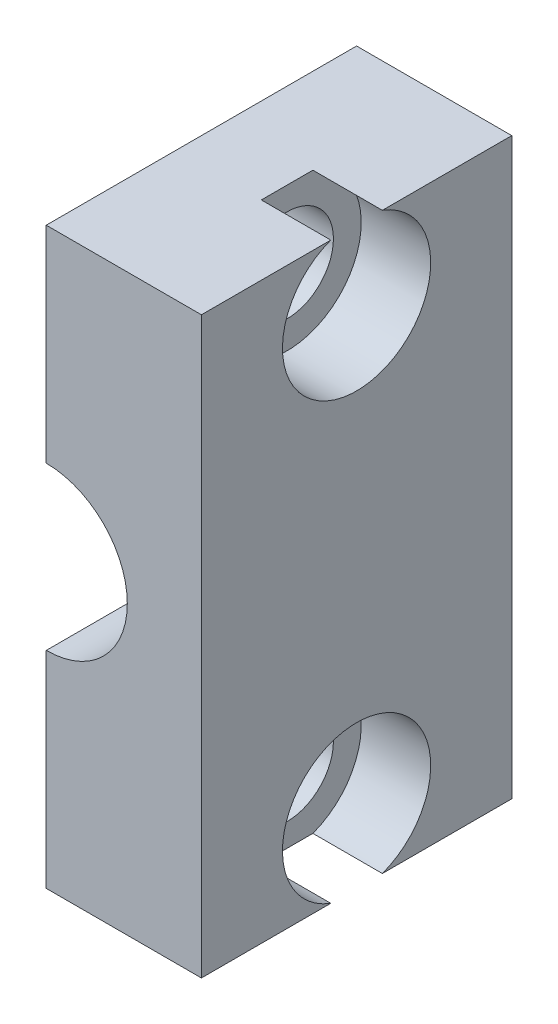
ISO-10303-21;
HEADER;
FILE_DESCRIPTION(('STEP AP214'),'2;1');
FILE_NAME('part.step','',(''),(''),'','','');
FILE_SCHEMA(('AUTOMOTIVE_DESIGN { 1 0 10303 214 1 1 1 1 }'));
ENDSEC;
DATA;
#1=APPLICATION_CONTEXT('core data for automotive mechanical design processes');
#2=APPLICATION_PROTOCOL_DEFINITION('international standard','automotive_design',2000,#1);
#3=PRODUCT_CONTEXT('',#1,'mechanical');
#4=PRODUCT('Part','Part','',(#3));
#5=PRODUCT_RELATED_PRODUCT_CATEGORY('part','',(#4));
#6=PRODUCT_DEFINITION_FORMATION('','',#4);
#7=PRODUCT_DEFINITION_CONTEXT('part definition',#1,'design');
#8=PRODUCT_DEFINITION('design','',#6,#7);
#9=PRODUCT_DEFINITION_SHAPE('','',#8);
#10=(LENGTH_UNIT() NAMED_UNIT(*) SI_UNIT(.MILLI.,.METRE.));
#11=(NAMED_UNIT(*) PLANE_ANGLE_UNIT() SI_UNIT($,.RADIAN.));
#12=(NAMED_UNIT(*) SI_UNIT($,.STERADIAN.) SOLID_ANGLE_UNIT());
#13=UNCERTAINTY_MEASURE_WITH_UNIT(LENGTH_MEASURE(1.E-05),#10,'distance_accuracy_value','');
#14=(GEOMETRIC_REPRESENTATION_CONTEXT(3) GLOBAL_UNCERTAINTY_ASSIGNED_CONTEXT((#13)) GLOBAL_UNIT_ASSIGNED_CONTEXT((#10,
#11,#12)) REPRESENTATION_CONTEXT('',''));
#15=CARTESIAN_POINT('',(0.,0.,0.));
#16=DIRECTION('',(0.,0.,1.));
#17=DIRECTION('',(1.,0.,0.));
#18=AXIS2_PLACEMENT_3D('',#15,#16,#17);
#19=CARTESIAN_POINT('',(0.,-4.7,1.35));
#20=DIRECTION('',(1.,0.,0.));
#21=DIRECTION('',(0.,0.,-1.));
#22=AXIS2_PLACEMENT_3D('',#19,#20,#21);
#23=CYLINDRICAL_SURFACE('',#22,1.);
#24=CARTESIAN_POINT('',(0.,-4.7,1.35));
#25=DIRECTION('',(1.,0.,0.));
#26=DIRECTION('',(0.,0.,-1.));
#27=AXIS2_PLACEMENT_3D('',#24,#25,#26);
#28=CIRCLE('',#27,1.);
#29=CARTESIAN_POINT('',(0.,-4.7,0.349999999999999));
#30=VERTEX_POINT('',#29);
#31=EDGE_CURVE('E259',#30,#30,#28,.T.);
#32=ORIENTED_EDGE('',*,*,#31,.F.);
#33=EDGE_LOOP('',(#32));
#34=FACE_BOUND('',#33,.T.);
#35=CARTESIAN_POINT('',(1.85,-4.7,1.35));
#36=DIRECTION('',(1.,0.,0.));
#37=DIRECTION('',(0.,0.,-1.));
#38=AXIS2_PLACEMENT_3D('',#35,#36,#37);
#39=CIRCLE('',#38,1.);
#40=CARTESIAN_POINT('',(1.85,-4.7,0.349999999999999));
#41=VERTEX_POINT('',#40);
#42=EDGE_CURVE('E274',#41,#41,#39,.T.);
#43=ORIENTED_EDGE('',*,*,#42,.T.);
#44=EDGE_LOOP('',(#43));
#45=FACE_BOUND('',#44,.T.);
#46=ADVANCED_FACE('F41',(#34,#45),#23,.F.);
#47=CARTESIAN_POINT('',(0.,4.7,1.35));
#48=DIRECTION('',(1.,0.,0.));
#49=DIRECTION('',(0.,0.,-1.));
#50=AXIS2_PLACEMENT_3D('',#47,#48,#49);
#51=CYLINDRICAL_SURFACE('',#50,1.);
#52=CARTESIAN_POINT('',(0.,4.7,1.35));
#53=DIRECTION('',(1.,0.,0.));
#54=DIRECTION('',(0.,0.,-1.));
#55=AXIS2_PLACEMENT_3D('',#52,#53,#54);
#56=CIRCLE('',#55,1.);
#57=CARTESIAN_POINT('',(0.,4.7,0.35));
#58=VERTEX_POINT('',#57);
#59=EDGE_CURVE('E258',#58,#58,#56,.T.);
#60=ORIENTED_EDGE('',*,*,#59,.F.);
#61=EDGE_LOOP('',(#60));
#62=FACE_BOUND('',#61,.T.);
#63=CARTESIAN_POINT('',(1.85,4.7,1.35));
#64=DIRECTION('',(1.,0.,0.));
#65=DIRECTION('',(0.,0.,-1.));
#66=AXIS2_PLACEMENT_3D('',#63,#64,#65);
#67=CIRCLE('',#66,1.);
#68=CARTESIAN_POINT('',(1.85,4.7,0.35));
#69=VERTEX_POINT('',#68);
#70=EDGE_CURVE('E149',#69,#69,#67,.T.);
#71=ORIENTED_EDGE('',*,*,#70,.T.);
#72=EDGE_LOOP('',(#71));
#73=FACE_BOUND('',#72,.T.);
#74=ADVANCED_FACE('F283',(#62,#73),#51,.F.);
#75=CARTESIAN_POINT('',(0.,0.,2.7));
#76=DIRECTION('',(1.,0.,0.));
#77=DIRECTION('',(0.,0.,-1.));
#78=AXIS2_PLACEMENT_3D('',#75,#76,#77);
#79=PLANE('',#78);
#80=ORIENTED_EDGE('',*,*,#59,.T.);
#81=EDGE_LOOP('',(#80));
#82=FACE_BOUND('',#81,.T.);
#83=DIRECTION('',(0.,-1.,0.));
#84=VECTOR('',#83,1.);
#85=CARTESIAN_POINT('',(0.,6.2,-2.));
#86=LINE('',#85,#84);
#87=CARTESIAN_POINT('',(0.,6.2,-2.));
#88=VERTEX_POINT('',#87);
#89=CARTESIAN_POINT('',(0.,1.75,-2.));
#90=VERTEX_POINT('',#89);
#91=EDGE_CURVE('E212',#88,#90,#86,.T.);
#92=ORIENTED_EDGE('',*,*,#91,.T.);
#93=DIRECTION('',(0.,0.,1.));
#94=VECTOR('',#93,1.);
#95=CARTESIAN_POINT('',(0.,1.75,-2.));
#96=LINE('',#95,#94);
#97=CARTESIAN_POINT('',(0.,1.75,0.));
#98=VERTEX_POINT('',#97);
#99=EDGE_CURVE('E243',#90,#98,#96,.T.);
#100=ORIENTED_EDGE('',*,*,#99,.T.);
#101=DIRECTION('',(0.,-1.,0.));
#102=VECTOR('',#101,1.);
#103=CARTESIAN_POINT('',(0.,6.2,0.));
#104=LINE('',#103,#102);
#105=CARTESIAN_POINT('',(0.,3.2,0.));
#106=VERTEX_POINT('',#105);
#107=EDGE_CURVE('E223',#106,#98,#104,.T.);
#108=ORIENTED_EDGE('',*,*,#107,.F.);
#109=DIRECTION('',(0.,0.,-1.));
#110=VECTOR('',#109,1.);
#111=CARTESIAN_POINT('',(0.,3.2,2.7));
#112=LINE('',#111,#110);
#113=CARTESIAN_POINT('',(0.,3.2,2.7));
#114=VERTEX_POINT('',#113);
#115=EDGE_CURVE('E166',#114,#106,#112,.T.);
#116=ORIENTED_EDGE('',*,*,#115,.F.);
#117=DIRECTION('',(0.,1.,0.));
#118=VECTOR('',#117,1.);
#119=CARTESIAN_POINT('',(0.,0.,2.7));
#120=LINE('',#119,#118);
#121=CARTESIAN_POINT('',(0.,1.75,2.7));
#122=VERTEX_POINT('',#121);
#123=EDGE_CURVE('E211',#122,#114,#120,.T.);
#124=ORIENTED_EDGE('',*,*,#123,.F.);
#125=CARTESIAN_POINT('',(0.,1.75,4.7));
#126=VERTEX_POINT('',#125);
#127=EDGE_CURVE('E249',#122,#126,#96,.T.);
#128=ORIENTED_EDGE('',*,*,#127,.T.);
#129=DIRECTION('',(0.,1.,0.));
#130=VECTOR('',#129,1.);
#131=CARTESIAN_POINT('',(0.,0.,4.7));
#132=LINE('',#131,#130);
#133=CARTESIAN_POINT('',(0.,6.2,4.7));
#134=VERTEX_POINT('',#133);
#135=EDGE_CURVE('E189',#126,#134,#132,.T.);
#136=ORIENTED_EDGE('',*,*,#135,.T.);
#137=DIRECTION('',(0.,0.,-1.));
#138=VECTOR('',#137,1.);
#139=CARTESIAN_POINT('',(0.,6.2,2.7));
#140=LINE('',#139,#138);
#141=EDGE_CURVE('E163',#134,#88,#140,.T.);
#142=ORIENTED_EDGE('',*,*,#141,.T.);
#143=EDGE_LOOP('',(#92,#100,#108,#116,#124,#128,#136,#142));
#144=FACE_BOUND('',#143,.T.);
#145=ADVANCED_FACE('F242',(#82,#144),#79,.F.);
#146=CARTESIAN_POINT('',(0.,0.,2.7));
#147=DIRECTION('',(0.,0.,-1.));
#148=DIRECTION('',(-1.,0.,0.));
#149=AXIS2_PLACEMENT_3D('',#146,#147,#148);
#150=CYLINDRICAL_SURFACE('',#149,3.2);
#151=CARTESIAN_POINT('',(0.,0.,0.));
#152=DIRECTION('',(0.,0.,1.));
#153=DIRECTION('',(1.,0.,0.));
#154=AXIS2_PLACEMENT_3D('',#151,#152,#153);
#155=CIRCLE('',#154,3.2);
#156=CARTESIAN_POINT('',(0.,-3.2,0.));
#157=VERTEX_POINT('',#156);
#158=EDGE_CURVE('E222',#157,#106,#155,.T.);
#159=ORIENTED_EDGE('',*,*,#158,.F.);
#160=DIRECTION('',(0.,0.,-1.));
#161=VECTOR('',#160,1.);
#162=CARTESIAN_POINT('',(0.,-3.2,2.7));
#163=LINE('',#162,#161);
#164=CARTESIAN_POINT('',(0.,-3.2,2.7));
#165=VERTEX_POINT('',#164);
#166=EDGE_CURVE('E176',#165,#157,#163,.T.);
#167=ORIENTED_EDGE('',*,*,#166,.F.);
#168=CARTESIAN_POINT('',(0.,0.,2.7));
#169=DIRECTION('',(0.,0.,1.));
#170=DIRECTION('',(1.,0.,0.));
#171=AXIS2_PLACEMENT_3D('',#168,#169,#170);
#172=CIRCLE('',#171,3.2);
#173=EDGE_CURVE('E226',#165,#114,#172,.T.);
#174=ORIENTED_EDGE('',*,*,#173,.T.);
#175=ORIENTED_EDGE('',*,*,#115,.T.);
#176=EDGE_LOOP('',(#159,#167,#174,#175));
#177=FACE_BOUND('',#176,.T.);
#178=ADVANCED_FACE('F43',(#177),#150,.F.);
#179=CARTESIAN_POINT('',(0.,-6.2,2.7));
#180=DIRECTION('',(0.,1.,0.));
#181=DIRECTION('',(0.,0.,1.));
#182=AXIS2_PLACEMENT_3D('',#179,#180,#181);
#183=PLANE('',#182);
#184=DIRECTION('',(0.,0.,-1.));
#185=VECTOR('',#184,1.);
#186=CARTESIAN_POINT('',(1.85,-6.2,2.7));
#187=LINE('',#186,#185);
#188=CARTESIAN_POINT('',(1.85,-6.2,1.906776436283));
#189=VERTEX_POINT('',#188);
#190=CARTESIAN_POINT('',(1.85,-6.2,0.793223563716998));
#191=VERTEX_POINT('',#190);
#192=EDGE_CURVE('E268',#189,#191,#187,.T.);
#193=ORIENTED_EDGE('',*,*,#192,.F.);
#194=DIRECTION('',(1.,0.,0.));
#195=VECTOR('',#194,1.);
#196=CARTESIAN_POINT('',(1.85,-6.2,1.906776436283));
#197=LINE('',#196,#195);
#198=CARTESIAN_POINT('',(3.35,-6.2,1.906776436283));
#199=VERTEX_POINT('',#198);
#200=EDGE_CURVE('E262',#189,#199,#197,.T.);
#201=ORIENTED_EDGE('',*,*,#200,.T.);
#202=DIRECTION('',(0.,0.,-1.));
#203=VECTOR('',#202,1.);
#204=CARTESIAN_POINT('',(3.35,-6.2,2.7));
#205=LINE('',#204,#203);
#206=CARTESIAN_POINT('',(3.35,-6.2,4.7));
#207=VERTEX_POINT('',#206);
#208=EDGE_CURVE('E170',#207,#199,#205,.T.);
#209=ORIENTED_EDGE('',*,*,#208,.F.);
#210=DIRECTION('',(-1.,0.,0.));
#211=VECTOR('',#210,1.);
#212=CARTESIAN_POINT('',(0.,-6.2,4.7));
#213=LINE('',#212,#211);
#214=CARTESIAN_POINT('',(0.,-6.2,4.7));
#215=VERTEX_POINT('',#214);
#216=EDGE_CURVE('E198',#207,#215,#213,.T.);
#217=ORIENTED_EDGE('',*,*,#216,.T.);
#218=DIRECTION('',(0.,0.,-1.));
#219=VECTOR('',#218,1.);
#220=CARTESIAN_POINT('',(0.,-6.2,2.7));
#221=LINE('',#220,#219);
#222=CARTESIAN_POINT('',(0.,-6.2,-2.));
#223=VERTEX_POINT('',#222);
#224=EDGE_CURVE('E173',#215,#223,#221,.T.);
#225=ORIENTED_EDGE('',*,*,#224,.T.);
#226=DIRECTION('',(1.,0.,0.));
#227=VECTOR('',#226,1.);
#228=CARTESIAN_POINT('',(0.,-6.2,-2.));
#229=LINE('',#228,#227);
#230=CARTESIAN_POINT('',(3.35,-6.2,-2.));
#231=VERTEX_POINT('',#230);
#232=EDGE_CURVE('E215',#223,#231,#229,.T.);
#233=ORIENTED_EDGE('',*,*,#232,.T.);
#234=CARTESIAN_POINT('',(3.35,-6.2,0.793223563716997));
#235=VERTEX_POINT('',#234);
#236=EDGE_CURVE('E165',#235,#231,#205,.T.);
#237=ORIENTED_EDGE('',*,*,#236,.F.);
#238=DIRECTION('',(1.,0.,0.));
#239=VECTOR('',#238,1.);
#240=CARTESIAN_POINT('',(1.85,-6.2,0.793223563716996));
#241=LINE('',#240,#239);
#242=EDGE_CURVE('E56',#235,#191,#241,.F.);
#243=ORIENTED_EDGE('',*,*,#242,.T.);
#244=EDGE_LOOP('',(#193,#201,#209,#217,#225,#233,#237,#243));
#245=FACE_BOUND('',#244,.T.);
#246=ADVANCED_FACE('F330',(#245),#183,.F.);
#247=CARTESIAN_POINT('',(3.35,0.,2.7));
#248=DIRECTION('',(1.,0.,0.));
#249=DIRECTION('',(0.,0.,-1.));
#250=AXIS2_PLACEMENT_3D('',#247,#248,#249);
#251=PLANE('',#250);
#252=CARTESIAN_POINT('',(3.35,4.7,1.35));
#253=DIRECTION('',(1.,0.,0.));
#254=DIRECTION('',(0.,0.,-1.));
#255=AXIS2_PLACEMENT_3D('',#252,#253,#254);
#256=CIRCLE('',#255,1.6);
#257=CARTESIAN_POINT('',(3.35,6.2,1.906776436283));
#258=VERTEX_POINT('',#257);
#259=CARTESIAN_POINT('',(3.35,6.2,0.793223563716996));
#260=VERTEX_POINT('',#259);
#261=EDGE_CURVE('E141',#258,#260,#256,.T.);
#262=ORIENTED_EDGE('',*,*,#261,.F.);
#263=DIRECTION('',(0.,0.,-1.));
#264=VECTOR('',#263,1.);
#265=CARTESIAN_POINT('',(3.35,6.2,2.7));
#266=LINE('',#265,#264);
#267=CARTESIAN_POINT('',(3.35,6.2,4.7));
#268=VERTEX_POINT('',#267);
#269=EDGE_CURVE('E162',#268,#258,#266,.T.);
#270=ORIENTED_EDGE('',*,*,#269,.F.);
#271=DIRECTION('',(0.,1.,0.));
#272=VECTOR('',#271,1.);
#273=CARTESIAN_POINT('',(3.35,0.,4.7));
#274=LINE('',#273,#272);
#275=EDGE_CURVE('E200',#207,#268,#274,.T.);
#276=ORIENTED_EDGE('',*,*,#275,.F.);
#277=ORIENTED_EDGE('',*,*,#208,.T.);
#278=CARTESIAN_POINT('',(3.35,-4.7,1.35));
#279=DIRECTION('',(1.,0.,0.));
#280=DIRECTION('',(0.,0.,-1.));
#281=AXIS2_PLACEMENT_3D('',#278,#279,#280);
#282=CIRCLE('',#281,1.6);
#283=EDGE_CURVE('E271',#235,#199,#282,.T.);
#284=ORIENTED_EDGE('',*,*,#283,.F.);
#285=ORIENTED_EDGE('',*,*,#236,.T.);
#286=DIRECTION('',(0.,-1.,0.));
#287=VECTOR('',#286,1.);
#288=CARTESIAN_POINT('',(3.35,6.2,-2.));
#289=LINE('',#288,#287);
#290=CARTESIAN_POINT('',(3.35,6.2,-2.));
#291=VERTEX_POINT('',#290);
#292=EDGE_CURVE('E161',#291,#231,#289,.T.);
#293=ORIENTED_EDGE('',*,*,#292,.F.);
#294=EDGE_CURVE('E154',#260,#291,#266,.T.);
#295=ORIENTED_EDGE('',*,*,#294,.F.);
#296=EDGE_LOOP('',(#262,#270,#276,#277,#284,#285,#293,#295));
#297=FACE_BOUND('',#296,.T.);
#298=ADVANCED_FACE('F159',(#297),#251,.T.);
#299=CARTESIAN_POINT('',(0.,6.2,2.7));
#300=DIRECTION('',(0.,1.,0.));
#301=DIRECTION('',(-1.,0.,0.));
#302=AXIS2_PLACEMENT_3D('',#299,#300,#301);
#303=PLANE('',#302);
#304=DIRECTION('',(1.,0.,0.));
#305=VECTOR('',#304,1.);
#306=CARTESIAN_POINT('',(1.85,6.2,1.90677643628301));
#307=LINE('',#306,#305);
#308=CARTESIAN_POINT('',(1.85,6.2,1.906776436283));
#309=VERTEX_POINT('',#308);
#310=EDGE_CURVE('E11',#309,#258,#307,.T.);
#311=ORIENTED_EDGE('',*,*,#310,.F.);
#312=DIRECTION('',(0.,0.,-1.));
#313=VECTOR('',#312,1.);
#314=CARTESIAN_POINT('',(1.85,6.2,2.7));
#315=LINE('',#314,#313);
#316=CARTESIAN_POINT('',(1.85,6.2,0.793223563716996));
#317=VERTEX_POINT('',#316);
#318=EDGE_CURVE('E156',#309,#317,#315,.T.);
#319=ORIENTED_EDGE('',*,*,#318,.T.);
#320=DIRECTION('',(1.,0.,0.));
#321=VECTOR('',#320,1.);
#322=CARTESIAN_POINT('',(1.85,6.2,0.793223563716994));
#323=LINE('',#322,#321);
#324=EDGE_CURVE('E49',#260,#317,#323,.F.);
#325=ORIENTED_EDGE('',*,*,#324,.F.);
#326=ORIENTED_EDGE('',*,*,#294,.T.);
#327=DIRECTION('',(1.,0.,0.));
#328=VECTOR('',#327,1.);
#329=CARTESIAN_POINT('',(0.,6.2,-2.));
#330=LINE('',#329,#328);
#331=EDGE_CURVE('E220',#88,#291,#330,.T.);
#332=ORIENTED_EDGE('',*,*,#331,.F.);
#333=ORIENTED_EDGE('',*,*,#141,.F.);
#334=DIRECTION('',(-1.,0.,0.));
#335=VECTOR('',#334,1.);
#336=CARTESIAN_POINT('',(0.,6.2,4.7));
#337=LINE('',#336,#335);
#338=EDGE_CURVE('E202',#268,#134,#337,.T.);
#339=ORIENTED_EDGE('',*,*,#338,.F.);
#340=ORIENTED_EDGE('',*,*,#269,.T.);
#341=EDGE_LOOP('',(#311,#319,#325,#326,#332,#333,#339,#340));
#342=FACE_BOUND('',#341,.T.);
#343=ADVANCED_FACE('F152',(#342),#303,.T.);
#344=ORIENTED_EDGE('',*,*,#31,.T.);
#345=EDGE_LOOP('',(#344));
#346=FACE_BOUND('',#345,.T.);
#347=CARTESIAN_POINT('',(0.,-1.75,4.7));
#348=VERTEX_POINT('',#347);
#349=EDGE_CURVE('E186',#215,#348,#132,.T.);
#350=ORIENTED_EDGE('',*,*,#349,.T.);
#351=DIRECTION('',(0.,0.,1.));
#352=VECTOR('',#351,1.);
#353=CARTESIAN_POINT('',(0.,-1.75,-2.));
#354=LINE('',#353,#352);
#355=CARTESIAN_POINT('',(0.,-1.75,2.7));
#356=VERTEX_POINT('',#355);
#357=EDGE_CURVE('E196',#348,#356,#354,.F.);
#358=ORIENTED_EDGE('',*,*,#357,.T.);
#359=EDGE_CURVE('E209',#165,#356,#120,.T.);
#360=ORIENTED_EDGE('',*,*,#359,.F.);
#361=ORIENTED_EDGE('',*,*,#166,.T.);
#362=CARTESIAN_POINT('',(0.,-1.75,0.));
#363=VERTEX_POINT('',#362);
#364=EDGE_CURVE('E208',#363,#157,#104,.T.);
#365=ORIENTED_EDGE('',*,*,#364,.F.);
#366=CARTESIAN_POINT('',(0.,-1.75,-2.));
#367=VERTEX_POINT('',#366);
#368=EDGE_CURVE('E247',#363,#367,#354,.F.);
#369=ORIENTED_EDGE('',*,*,#368,.T.);
#370=EDGE_CURVE('E216',#367,#223,#86,.T.);
#371=ORIENTED_EDGE('',*,*,#370,.T.);
#372=ORIENTED_EDGE('',*,*,#224,.F.);
#373=EDGE_LOOP('',(#350,#358,#360,#361,#365,#369,#371,#372));
#374=FACE_BOUND('',#373,.T.);
#375=ADVANCED_FACE('F194',(#346,#374),#79,.F.);
#376=CARTESIAN_POINT('',(0.,0.,0.));
#377=DIRECTION('',(0.,0.,1.));
#378=DIRECTION('',(1.,0.,0.));
#379=AXIS2_PLACEMENT_3D('',#376,#377,#378);
#380=PLANE('',#379);
#381=CARTESIAN_POINT('',(0.,0.,0.));
#382=DIRECTION('',(0.,0.,1.));
#383=DIRECTION('',(1.,0.,0.));
#384=AXIS2_PLACEMENT_3D('',#381,#382,#383);
#385=CIRCLE('',#384,1.75);
#386=EDGE_CURVE('E251',#363,#98,#385,.T.);
#387=ORIENTED_EDGE('',*,*,#386,.F.);
#388=ORIENTED_EDGE('',*,*,#364,.T.);
#389=ORIENTED_EDGE('',*,*,#158,.T.);
#390=ORIENTED_EDGE('',*,*,#107,.T.);
#391=EDGE_LOOP('',(#387,#388,#389,#390));
#392=FACE_BOUND('',#391,.T.);
#393=ADVANCED_FACE('F239',(#392),#380,.T.);
#394=CARTESIAN_POINT('',(0.,0.,-2.));
#395=DIRECTION('',(0.,0.,1.));
#396=DIRECTION('',(1.,0.,0.));
#397=AXIS2_PLACEMENT_3D('',#394,#395,#396);
#398=PLANE('',#397);
#399=ORIENTED_EDGE('',*,*,#370,.F.);
#400=CARTESIAN_POINT('',(0.,0.,-2.));
#401=DIRECTION('',(0.,0.,1.));
#402=DIRECTION('',(1.,0.,0.));
#403=AXIS2_PLACEMENT_3D('',#400,#401,#402);
#404=CIRCLE('',#403,1.75);
#405=EDGE_CURVE('E254',#367,#90,#404,.T.);
#406=ORIENTED_EDGE('',*,*,#405,.T.);
#407=ORIENTED_EDGE('',*,*,#91,.F.);
#408=ORIENTED_EDGE('',*,*,#331,.T.);
#409=ORIENTED_EDGE('',*,*,#292,.T.);
#410=ORIENTED_EDGE('',*,*,#232,.F.);
#411=EDGE_LOOP('',(#399,#406,#407,#408,#409,#410));
#412=FACE_BOUND('',#411,.T.);
#413=ADVANCED_FACE('F317',(#412),#398,.F.);
#414=CARTESIAN_POINT('',(0.,0.,2.7));
#415=DIRECTION('',(0.,0.,-1.));
#416=DIRECTION('',(-1.,0.,0.));
#417=AXIS2_PLACEMENT_3D('',#414,#415,#416);
#418=PLANE('',#417);
#419=CARTESIAN_POINT('',(0.,0.,2.7));
#420=DIRECTION('',(0.,0.,-1.));
#421=DIRECTION('',(-1.,0.,0.));
#422=AXIS2_PLACEMENT_3D('',#419,#420,#421);
#423=CIRCLE('',#422,1.75);
#424=EDGE_CURVE('E253',#122,#356,#423,.T.);
#425=ORIENTED_EDGE('',*,*,#424,.F.);
#426=ORIENTED_EDGE('',*,*,#123,.T.);
#427=ORIENTED_EDGE('',*,*,#173,.F.);
#428=ORIENTED_EDGE('',*,*,#359,.T.);
#429=EDGE_LOOP('',(#425,#426,#427,#428));
#430=FACE_BOUND('',#429,.T.);
#431=ADVANCED_FACE('F314',(#430),#418,.T.);
#432=CARTESIAN_POINT('',(0.,0.,4.7));
#433=DIRECTION('',(0.,0.,-1.));
#434=DIRECTION('',(-1.,0.,0.));
#435=AXIS2_PLACEMENT_3D('',#432,#433,#434);
#436=PLANE('',#435);
#437=ORIENTED_EDGE('',*,*,#135,.F.);
#438=CARTESIAN_POINT('',(0.,0.,4.7));
#439=DIRECTION('',(0.,0.,-1.));
#440=DIRECTION('',(-1.,0.,0.));
#441=AXIS2_PLACEMENT_3D('',#438,#439,#440);
#442=CIRCLE('',#441,1.75);
#443=EDGE_CURVE('E157',#126,#348,#442,.T.);
#444=ORIENTED_EDGE('',*,*,#443,.T.);
#445=ORIENTED_EDGE('',*,*,#349,.F.);
#446=ORIENTED_EDGE('',*,*,#216,.F.);
#447=ORIENTED_EDGE('',*,*,#275,.T.);
#448=ORIENTED_EDGE('',*,*,#338,.T.);
#449=EDGE_LOOP('',(#437,#444,#445,#446,#447,#448));
#450=FACE_BOUND('',#449,.T.);
#451=ADVANCED_FACE('F184',(#450),#436,.F.);
#452=CARTESIAN_POINT('',(0.,0.,-2.));
#453=DIRECTION('',(0.,0.,1.));
#454=DIRECTION('',(1.,0.,0.));
#455=AXIS2_PLACEMENT_3D('',#452,#453,#454);
#456=CYLINDRICAL_SURFACE('',#455,1.75);
#457=ORIENTED_EDGE('',*,*,#424,.T.);
#458=ORIENTED_EDGE('',*,*,#357,.F.);
#459=ORIENTED_EDGE('',*,*,#443,.F.);
#460=ORIENTED_EDGE('',*,*,#127,.F.);
#461=EDGE_LOOP('',(#457,#458,#459,#460));
#462=FACE_BOUND('',#461,.T.);
#463=ADVANCED_FACE('F311',(#462),#456,.F.);
#464=ORIENTED_EDGE('',*,*,#405,.F.);
#465=ORIENTED_EDGE('',*,*,#368,.F.);
#466=ORIENTED_EDGE('',*,*,#386,.T.);
#467=ORIENTED_EDGE('',*,*,#99,.F.);
#468=EDGE_LOOP('',(#464,#465,#466,#467));
#469=FACE_BOUND('',#468,.T.);
#470=ADVANCED_FACE('F295',(#469),#456,.F.);
#471=CARTESIAN_POINT('',(1.85,4.7,1.35));
#472=DIRECTION('',(1.,0.,0.));
#473=DIRECTION('',(0.,0.,-1.));
#474=AXIS2_PLACEMENT_3D('',#471,#472,#473);
#475=CYLINDRICAL_SURFACE('',#474,1.6);
#476=ORIENTED_EDGE('',*,*,#310,.T.);
#477=ORIENTED_EDGE('',*,*,#261,.T.);
#478=ORIENTED_EDGE('',*,*,#324,.T.);
#479=CARTESIAN_POINT('',(1.85,4.7,1.35));
#480=DIRECTION('',(1.,0.,0.));
#481=DIRECTION('',(0.,0.,-1.));
#482=AXIS2_PLACEMENT_3D('',#479,#480,#481);
#483=CIRCLE('',#482,1.6);
#484=EDGE_CURVE('E63',#309,#317,#483,.T.);
#485=ORIENTED_EDGE('',*,*,#484,.F.);
#486=EDGE_LOOP('',(#476,#477,#478,#485));
#487=FACE_BOUND('',#486,.T.);
#488=ADVANCED_FACE('F143',(#487),#475,.F.);
#489=CARTESIAN_POINT('',(1.85,4.7,1.35));
#490=DIRECTION('',(1.,0.,0.));
#491=DIRECTION('',(0.,0.,-1.));
#492=AXIS2_PLACEMENT_3D('',#489,#490,#491);
#493=PLANE('',#492);
#494=ORIENTED_EDGE('',*,*,#70,.F.);
#495=EDGE_LOOP('',(#494));
#496=FACE_BOUND('',#495,.T.);
#497=ORIENTED_EDGE('',*,*,#484,.T.);
#498=ORIENTED_EDGE('',*,*,#318,.F.);
#499=EDGE_LOOP('',(#497,#498));
#500=FACE_BOUND('',#499,.T.);
#501=ADVANCED_FACE('F285',(#496,#500),#493,.T.);
#502=CARTESIAN_POINT('',(1.85,-4.7,1.35));
#503=DIRECTION('',(1.,0.,0.));
#504=DIRECTION('',(0.,0.,-1.));
#505=AXIS2_PLACEMENT_3D('',#502,#503,#504);
#506=CYLINDRICAL_SURFACE('',#505,1.6);
#507=CARTESIAN_POINT('',(1.85,-4.7,1.35));
#508=DIRECTION('',(1.,0.,0.));
#509=DIRECTION('',(0.,0.,-1.));
#510=AXIS2_PLACEMENT_3D('',#507,#508,#509);
#511=CIRCLE('',#510,1.6);
#512=EDGE_CURVE('E273',#191,#189,#511,.T.);
#513=ORIENTED_EDGE('',*,*,#512,.F.);
#514=ORIENTED_EDGE('',*,*,#242,.F.);
#515=ORIENTED_EDGE('',*,*,#283,.T.);
#516=ORIENTED_EDGE('',*,*,#200,.F.);
#517=EDGE_LOOP('',(#513,#514,#515,#516));
#518=FACE_BOUND('',#517,.T.);
#519=ADVANCED_FACE('F287',(#518),#506,.F.);
#520=CARTESIAN_POINT('',(1.85,-4.7,1.35));
#521=DIRECTION('',(1.,0.,0.));
#522=DIRECTION('',(0.,0.,-1.));
#523=AXIS2_PLACEMENT_3D('',#520,#521,#522);
#524=PLANE('',#523);
#525=ORIENTED_EDGE('',*,*,#42,.F.);
#526=EDGE_LOOP('',(#525));
#527=FACE_BOUND('',#526,.T.);
#528=ORIENTED_EDGE('',*,*,#192,.T.);
#529=ORIENTED_EDGE('',*,*,#512,.T.);
#530=EDGE_LOOP('',(#528,#529));
#531=FACE_BOUND('',#530,.T.);
#532=ADVANCED_FACE('F293',(#527,#531),#524,.T.);
#533=CLOSED_SHELL('',(#46,#74,#145,#178,#246,#298,#343,#375,#393,#413,#431,#451,#463,#470,#488,
#501,#519,#532));
#534=MANIFOLD_SOLID_BREP('B2',#533);
#535=ADVANCED_BREP_SHAPE_REPRESENTATION('',(#18,#534),#14);
#536=SHAPE_DEFINITION_REPRESENTATION(#9,#535);
ENDSEC;
END-ISO-10303-21;
